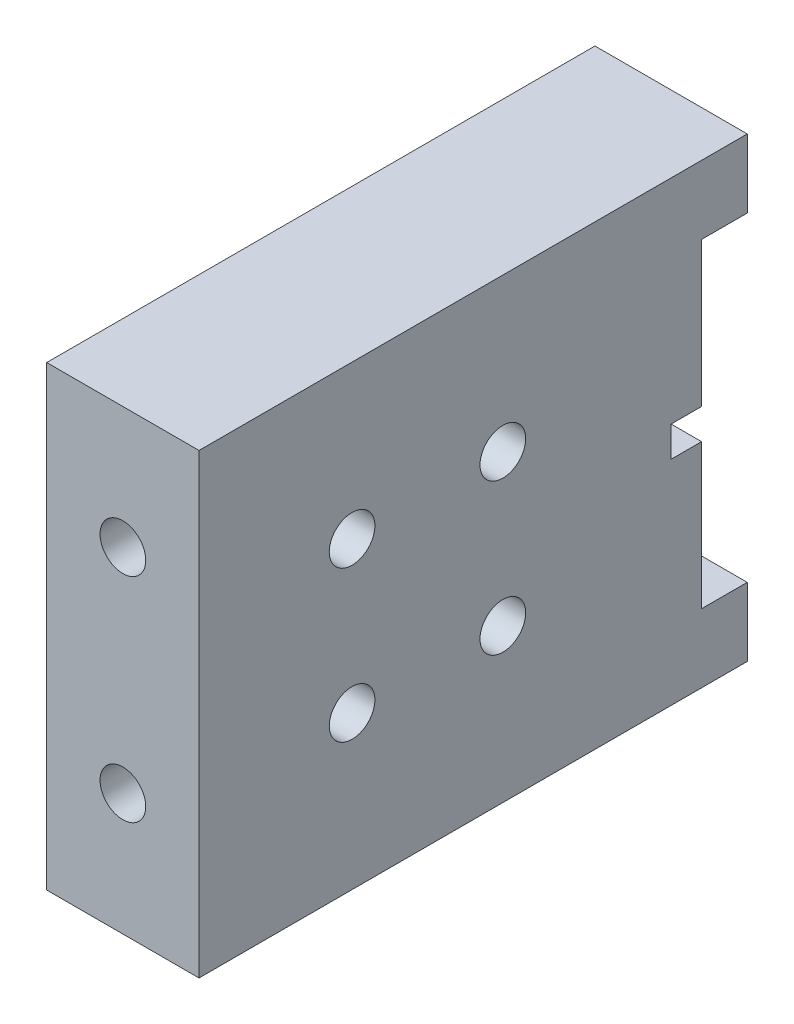
ISO-10303-21;
HEADER;
FILE_DESCRIPTION(('STEP AP214'),'2;1');
FILE_NAME('part.step','',(''),(''),'','','');
FILE_SCHEMA(('AUTOMOTIVE_DESIGN { 1 0 10303 214 1 1 1 1 }'));
ENDSEC;
DATA;
#1=APPLICATION_CONTEXT('core data for automotive mechanical design processes');
#2=APPLICATION_PROTOCOL_DEFINITION('international standard','automotive_design',2000,#1);
#3=PRODUCT_CONTEXT('',#1,'mechanical');
#4=PRODUCT('Part','Part','',(#3));
#5=PRODUCT_RELATED_PRODUCT_CATEGORY('part','',(#4));
#6=PRODUCT_DEFINITION_FORMATION('','',#4);
#7=PRODUCT_DEFINITION_CONTEXT('part definition',#1,'design');
#8=PRODUCT_DEFINITION('design','',#6,#7);
#9=PRODUCT_DEFINITION_SHAPE('','',#8);
#10=(LENGTH_UNIT() NAMED_UNIT(*) SI_UNIT(.MILLI.,.METRE.));
#11=(NAMED_UNIT(*) PLANE_ANGLE_UNIT() SI_UNIT($,.RADIAN.));
#12=(NAMED_UNIT(*) SI_UNIT($,.STERADIAN.) SOLID_ANGLE_UNIT());
#13=UNCERTAINTY_MEASURE_WITH_UNIT(LENGTH_MEASURE(1.E-05),#10,'distance_accuracy_value','');
#14=(GEOMETRIC_REPRESENTATION_CONTEXT(3) GLOBAL_UNCERTAINTY_ASSIGNED_CONTEXT((#13)) GLOBAL_UNIT_ASSIGNED_CONTEXT((#10,
#11,#12)) REPRESENTATION_CONTEXT('',''));
#15=CARTESIAN_POINT('',(0.,0.,0.));
#16=DIRECTION('',(0.,0.,1.));
#17=DIRECTION('',(1.,0.,0.));
#18=AXIS2_PLACEMENT_3D('',#15,#16,#17);
#19=CARTESIAN_POINT('',(10.,14.,-33.));
#20=DIRECTION('',(1.,0.,0.));
#21=DIRECTION('',(0.,0.,-1.));
#22=AXIS2_PLACEMENT_3D('',#19,#20,#21);
#23=PLANE('',#22);
#24=DIRECTION('',(0.,-1.,0.));
#25=VECTOR('',#24,1.);
#26=CARTESIAN_POINT('',(10.,4.5,-33.));
#27=LINE('',#26,#25);
#28=CARTESIAN_POINT('',(9.99999999999999,25.5,-33.));
#29=VERTEX_POINT('',#28);
#30=CARTESIAN_POINT('',(10.,16.,-33.));
#31=VERTEX_POINT('',#30);
#32=EDGE_CURVE('E131',#29,#31,#27,.T.);
#33=ORIENTED_EDGE('',*,*,#32,.F.);
#34=DIRECTION('',(0.,0.,-1.));
#35=VECTOR('',#34,1.);
#36=CARTESIAN_POINT('',(10.,25.5,-33.));
#37=LINE('',#36,#35);
#38=CARTESIAN_POINT('',(10.,25.5,-36.));
#39=VERTEX_POINT('',#38);
#40=EDGE_CURVE('E135',#29,#39,#37,.T.);
#41=ORIENTED_EDGE('',*,*,#40,.T.);
#42=DIRECTION('',(0.,-1.,0.));
#43=VECTOR('',#42,1.);
#44=CARTESIAN_POINT('',(10.,30.,-36.));
#45=LINE('',#44,#43);
#46=CARTESIAN_POINT('',(10.,30.,-36.));
#47=VERTEX_POINT('',#46);
#48=EDGE_CURVE('E217',#47,#39,#45,.T.);
#49=ORIENTED_EDGE('',*,*,#48,.F.);
#50=DIRECTION('',(0.,0.,-1.));
#51=VECTOR('',#50,1.);
#52=CARTESIAN_POINT('',(9.99999999999994,30.,0.));
#53=LINE('',#52,#51);
#54=CARTESIAN_POINT('',(10.,30.,0.));
#55=VERTEX_POINT('',#54);
#56=EDGE_CURVE('E249',#55,#47,#53,.T.);
#57=ORIENTED_EDGE('',*,*,#56,.F.);
#58=DIRECTION('',(0.,-1.,0.));
#59=VECTOR('',#58,1.);
#60=CARTESIAN_POINT('',(10.,30.,0.));
#61=LINE('',#60,#59);
#62=CARTESIAN_POINT('',(10.,0.,0.));
#63=VERTEX_POINT('',#62);
#64=EDGE_CURVE('E241',#55,#63,#61,.T.);
#65=ORIENTED_EDGE('',*,*,#64,.T.);
#66=DIRECTION('',(0.,0.,-1.));
#67=VECTOR('',#66,1.);
#68=CARTESIAN_POINT('',(9.99999999999994,0.,0.));
#69=LINE('',#68,#67);
#70=CARTESIAN_POINT('',(10.,0.,-36.));
#71=VERTEX_POINT('',#70);
#72=EDGE_CURVE('E234',#63,#71,#69,.T.);
#73=ORIENTED_EDGE('',*,*,#72,.T.);
#74=CARTESIAN_POINT('',(10.,4.5,-36.));
#75=VERTEX_POINT('',#74);
#76=EDGE_CURVE('E236',#75,#71,#45,.T.);
#77=ORIENTED_EDGE('',*,*,#76,.F.);
#78=DIRECTION('',(0.,0.,-1.));
#79=VECTOR('',#78,1.);
#80=CARTESIAN_POINT('',(10.,4.5,-33.));
#81=LINE('',#80,#79);
#82=CARTESIAN_POINT('',(10.,4.5,-33.));
#83=VERTEX_POINT('',#82);
#84=EDGE_CURVE('E159',#83,#75,#81,.T.);
#85=ORIENTED_EDGE('',*,*,#84,.F.);
#86=CARTESIAN_POINT('',(10.,14.,-33.));
#87=VERTEX_POINT('',#86);
#88=EDGE_CURVE('E142',#87,#83,#27,.T.);
#89=ORIENTED_EDGE('',*,*,#88,.F.);
#90=DIRECTION('',(0.,0.,1.));
#91=VECTOR('',#90,1.);
#92=CARTESIAN_POINT('',(10.,14.,0.));
#93=LINE('',#92,#91);
#94=CARTESIAN_POINT('',(10.,14.,-31.));
#95=VERTEX_POINT('',#94);
#96=EDGE_CURVE('E173',#87,#95,#93,.T.);
#97=ORIENTED_EDGE('',*,*,#96,.T.);
#98=DIRECTION('',(0.,-1.,0.));
#99=VECTOR('',#98,1.);
#100=CARTESIAN_POINT('',(10.,30.,-31.));
#101=LINE('',#100,#99);
#102=CARTESIAN_POINT('',(10.,16.,-31.));
#103=VERTEX_POINT('',#102);
#104=EDGE_CURVE('E171',#103,#95,#101,.T.);
#105=ORIENTED_EDGE('',*,*,#104,.F.);
#106=DIRECTION('',(0.,0.,-1.));
#107=VECTOR('',#106,1.);
#108=CARTESIAN_POINT('',(10.,16.,0.));
#109=LINE('',#108,#107);
#110=EDGE_CURVE('E138',#103,#31,#109,.T.);
#111=ORIENTED_EDGE('',*,*,#110,.T.);
#112=EDGE_LOOP('',(#33,#41,#49,#57,#65,#73,#77,#85,#89,#97,#105,#111));
#113=FACE_BOUND('',#112,.T.);
#114=CARTESIAN_POINT('',(10.,19.9497474683058,-10.0502525316942));
#115=DIRECTION('',(-1.,0.,0.));
#116=DIRECTION('',(0.,0.,1.));
#117=AXIS2_PLACEMENT_3D('',#114,#115,#116);
#118=CIRCLE('',#117,1.5);
#119=CARTESIAN_POINT('',(10.,19.9497474683058,-8.55025253169417));
#120=VERTEX_POINT('',#119);
#121=EDGE_CURVE('E220',#120,#120,#118,.T.);
#122=ORIENTED_EDGE('',*,*,#121,.T.);
#123=EDGE_LOOP('',(#122));
#124=FACE_BOUND('',#123,.T.);
#125=CARTESIAN_POINT('',(10.,10.0502525316942,-19.9497474683058));
#126=DIRECTION('',(-1.,0.,0.));
#127=DIRECTION('',(0.,0.,1.));
#128=AXIS2_PLACEMENT_3D('',#125,#126,#127);
#129=CIRCLE('',#128,1.5);
#130=CARTESIAN_POINT('',(10.,10.0502525316942,-18.4497474683058));
#131=VERTEX_POINT('',#130);
#132=EDGE_CURVE('E223',#131,#131,#129,.T.);
#133=ORIENTED_EDGE('',*,*,#132,.T.);
#134=EDGE_LOOP('',(#133));
#135=FACE_BOUND('',#134,.T.);
#136=CARTESIAN_POINT('',(10.,10.0502525316942,-10.0502525316942));
#137=DIRECTION('',(-1.,0.,0.));
#138=DIRECTION('',(0.,0.,1.));
#139=AXIS2_PLACEMENT_3D('',#136,#137,#138);
#140=CIRCLE('',#139,1.5);
#141=CARTESIAN_POINT('',(10.,10.0502525316942,-8.55025253169416));
#142=VERTEX_POINT('',#141);
#143=EDGE_CURVE('E227',#142,#142,#140,.T.);
#144=ORIENTED_EDGE('',*,*,#143,.T.);
#145=EDGE_LOOP('',(#144));
#146=FACE_BOUND('',#145,.T.);
#147=CARTESIAN_POINT('',(10.,19.9497474683058,-19.9497474683058));
#148=DIRECTION('',(-1.,0.,0.));
#149=DIRECTION('',(0.,0.,1.));
#150=AXIS2_PLACEMENT_3D('',#147,#148,#149);
#151=CIRCLE('',#150,1.5);
#152=CARTESIAN_POINT('',(10.,19.9497474683058,-18.4497474683058));
#153=VERTEX_POINT('',#152);
#154=EDGE_CURVE('E231',#153,#153,#151,.T.);
#155=ORIENTED_EDGE('',*,*,#154,.T.);
#156=EDGE_LOOP('',(#155));
#157=FACE_BOUND('',#156,.T.);
#158=ADVANCED_FACE('F37',(#113,#124,#135,#146,#157),#23,.T.);
#159=CARTESIAN_POINT('',(5.4,9.99999999999999,-29.));
#160=DIRECTION('',(0.,0.,-1.));
#161=DIRECTION('',(-1.,0.,0.));
#162=AXIS2_PLACEMENT_3D('',#159,#160,#161);
#163=PLANE('',#162);
#164=CARTESIAN_POINT('',(5.4,9.99999999999999,-29.));
#165=DIRECTION('',(0.,0.,-1.));
#166=DIRECTION('',(-1.,0.,0.));
#167=AXIS2_PLACEMENT_3D('',#164,#165,#166);
#168=CIRCLE('',#167,1.);
#169=CARTESIAN_POINT('',(4.4,9.99999999999999,-29.));
#170=VERTEX_POINT('',#169);
#171=EDGE_CURVE('E183',#170,#170,#168,.T.);
#172=ORIENTED_EDGE('',*,*,#171,.T.);
#173=EDGE_LOOP('',(#172));
#174=FACE_BOUND('',#173,.T.);
#175=ADVANCED_FACE('F317',(#174),#163,.T.);
#176=CARTESIAN_POINT('',(5.,22.,-4.));
#177=DIRECTION('',(0.,0.,1.));
#178=DIRECTION('',(1.,0.,0.));
#179=AXIS2_PLACEMENT_3D('',#176,#177,#178);
#180=PLANE('',#179);
#181=CARTESIAN_POINT('',(5.,22.,-4.));
#182=DIRECTION('',(0.,0.,1.));
#183=DIRECTION('',(1.,0.,0.));
#184=AXIS2_PLACEMENT_3D('',#181,#182,#183);
#185=CIRCLE('',#184,1.5);
#186=CARTESIAN_POINT('',(6.5,22.,-4.));
#187=VERTEX_POINT('',#186);
#188=EDGE_CURVE('E193',#187,#187,#185,.T.);
#189=ORIENTED_EDGE('',*,*,#188,.T.);
#190=EDGE_LOOP('',(#189));
#191=FACE_BOUND('',#190,.T.);
#192=ADVANCED_FACE('F319',(#191),#180,.T.);
#193=CARTESIAN_POINT('',(5.,8.,-4.));
#194=DIRECTION('',(0.,0.,1.));
#195=DIRECTION('',(1.,0.,0.));
#196=AXIS2_PLACEMENT_3D('',#193,#194,#195);
#197=PLANE('',#196);
#198=CARTESIAN_POINT('',(5.,8.,-4.));
#199=DIRECTION('',(0.,0.,1.));
#200=DIRECTION('',(1.,0.,0.));
#201=AXIS2_PLACEMENT_3D('',#198,#199,#200);
#202=CIRCLE('',#201,1.5);
#203=CARTESIAN_POINT('',(6.5,8.,-4.));
#204=VERTEX_POINT('',#203);
#205=EDGE_CURVE('E46',#204,#204,#202,.T.);
#206=ORIENTED_EDGE('',*,*,#205,.T.);
#207=EDGE_LOOP('',(#206));
#208=FACE_BOUND('',#207,.T.);
#209=ADVANCED_FACE('F326',(#208),#197,.T.);
#210=CARTESIAN_POINT('',(5.4,20.,-29.));
#211=DIRECTION('',(0.,0.,-1.));
#212=DIRECTION('',(-1.,0.,0.));
#213=AXIS2_PLACEMENT_3D('',#210,#211,#212);
#214=PLANE('',#213);
#215=CARTESIAN_POINT('',(5.4,20.,-29.));
#216=DIRECTION('',(0.,0.,-1.));
#217=DIRECTION('',(-1.,0.,0.));
#218=AXIS2_PLACEMENT_3D('',#215,#216,#217);
#219=CIRCLE('',#218,1.);
#220=CARTESIAN_POINT('',(4.4,20.,-29.));
#221=VERTEX_POINT('',#220);
#222=EDGE_CURVE('E187',#221,#221,#219,.T.);
#223=ORIENTED_EDGE('',*,*,#222,.T.);
#224=EDGE_LOOP('',(#223));
#225=FACE_BOUND('',#224,.T.);
#226=ADVANCED_FACE('F338',(#225),#214,.T.);
#227=CARTESIAN_POINT('',(5.4,9.99999999999999,-29.));
#228=DIRECTION('',(0.,0.,-1.));
#229=DIRECTION('',(-1.,0.,0.));
#230=AXIS2_PLACEMENT_3D('',#227,#228,#229);
#231=CYLINDRICAL_SURFACE('',#230,1.);
#232=ORIENTED_EDGE('',*,*,#171,.F.);
#233=EDGE_LOOP('',(#232));
#234=FACE_BOUND('',#233,.T.);
#235=CARTESIAN_POINT('',(5.4,9.99999999999999,-33.));
#236=DIRECTION('',(0.,0.,-1.));
#237=DIRECTION('',(-1.,0.,0.));
#238=AXIS2_PLACEMENT_3D('',#235,#236,#237);
#239=CIRCLE('',#238,1.);
#240=CARTESIAN_POINT('',(4.4,9.99999999999999,-33.));
#241=VERTEX_POINT('',#240);
#242=EDGE_CURVE('E184',#241,#241,#239,.T.);
#243=ORIENTED_EDGE('',*,*,#242,.T.);
#244=EDGE_LOOP('',(#243));
#245=FACE_BOUND('',#244,.T.);
#246=ADVANCED_FACE('F332',(#234,#245),#231,.F.);
#247=CARTESIAN_POINT('',(5.,22.,-4.));
#248=DIRECTION('',(0.,0.,1.));
#249=DIRECTION('',(1.,0.,0.));
#250=AXIS2_PLACEMENT_3D('',#247,#248,#249);
#251=CYLINDRICAL_SURFACE('',#250,1.5);
#252=ORIENTED_EDGE('',*,*,#188,.F.);
#253=EDGE_LOOP('',(#252));
#254=FACE_BOUND('',#253,.T.);
#255=CARTESIAN_POINT('',(5.,22.,0.));
#256=DIRECTION('',(0.,0.,1.));
#257=DIRECTION('',(1.,0.,0.));
#258=AXIS2_PLACEMENT_3D('',#255,#256,#257);
#259=CIRCLE('',#258,1.5);
#260=CARTESIAN_POINT('',(6.5,22.,0.));
#261=VERTEX_POINT('',#260);
#262=EDGE_CURVE('E196',#261,#261,#259,.T.);
#263=ORIENTED_EDGE('',*,*,#262,.T.);
#264=EDGE_LOOP('',(#263));
#265=FACE_BOUND('',#264,.T.);
#266=ADVANCED_FACE('F342',(#254,#265),#251,.F.);
#267=CARTESIAN_POINT('',(5.,8.,-4.));
#268=DIRECTION('',(0.,0.,1.));
#269=DIRECTION('',(1.,0.,0.));
#270=AXIS2_PLACEMENT_3D('',#267,#268,#269);
#271=CYLINDRICAL_SURFACE('',#270,1.5);
#272=ORIENTED_EDGE('',*,*,#205,.F.);
#273=EDGE_LOOP('',(#272));
#274=FACE_BOUND('',#273,.T.);
#275=CARTESIAN_POINT('',(5.,8.,0.));
#276=DIRECTION('',(0.,0.,1.));
#277=DIRECTION('',(1.,0.,0.));
#278=AXIS2_PLACEMENT_3D('',#275,#276,#277);
#279=CIRCLE('',#278,1.5);
#280=CARTESIAN_POINT('',(6.5,8.,0.));
#281=VERTEX_POINT('',#280);
#282=EDGE_CURVE('E11',#281,#281,#279,.T.);
#283=ORIENTED_EDGE('',*,*,#282,.T.);
#284=EDGE_LOOP('',(#283));
#285=FACE_BOUND('',#284,.T.);
#286=ADVANCED_FACE('F344',(#274,#285),#271,.F.);
#287=CARTESIAN_POINT('',(10.,25.5,-33.));
#288=DIRECTION('',(0.,1.,0.));
#289=DIRECTION('',(0.,0.,1.));
#290=AXIS2_PLACEMENT_3D('',#287,#288,#289);
#291=PLANE('',#290);
#292=DIRECTION('',(1.,0.,0.));
#293=VECTOR('',#292,1.);
#294=CARTESIAN_POINT('',(10.,25.5,-36.));
#295=LINE('',#294,#293);
#296=CARTESIAN_POINT('',(2.,25.5,-36.));
#297=VERTEX_POINT('',#296);
#298=EDGE_CURVE('E151',#297,#39,#295,.T.);
#299=ORIENTED_EDGE('',*,*,#298,.T.);
#300=ORIENTED_EDGE('',*,*,#40,.F.);
#301=DIRECTION('',(1.,0.,0.));
#302=VECTOR('',#301,1.);
#303=CARTESIAN_POINT('',(10.,25.5,-33.));
#304=LINE('',#303,#302);
#305=CARTESIAN_POINT('',(2.,25.5,-33.));
#306=VERTEX_POINT('',#305);
#307=EDGE_CURVE('E149',#306,#29,#304,.T.);
#308=ORIENTED_EDGE('',*,*,#307,.F.);
#309=DIRECTION('',(0.,0.,-1.));
#310=VECTOR('',#309,1.);
#311=CARTESIAN_POINT('',(2.,25.5,-33.));
#312=LINE('',#311,#310);
#313=EDGE_CURVE('E152',#306,#297,#312,.T.);
#314=ORIENTED_EDGE('',*,*,#313,.T.);
#315=EDGE_LOOP('',(#299,#300,#308,#314));
#316=FACE_BOUND('',#315,.T.);
#317=ADVANCED_FACE('F147',(#316),#291,.F.);
#318=CARTESIAN_POINT('',(5.4,20.,-29.));
#319=DIRECTION('',(0.,0.,-1.));
#320=DIRECTION('',(-1.,0.,0.));
#321=AXIS2_PLACEMENT_3D('',#318,#319,#320);
#322=CYLINDRICAL_SURFACE('',#321,1.);
#323=ORIENTED_EDGE('',*,*,#222,.F.);
#324=EDGE_LOOP('',(#323));
#325=FACE_BOUND('',#324,.T.);
#326=CARTESIAN_POINT('',(5.4,20.,-33.));
#327=DIRECTION('',(0.,0.,-1.));
#328=DIRECTION('',(-1.,0.,0.));
#329=AXIS2_PLACEMENT_3D('',#326,#327,#328);
#330=CIRCLE('',#329,1.);
#331=CARTESIAN_POINT('',(4.4,20.,-33.));
#332=VERTEX_POINT('',#331);
#333=EDGE_CURVE('E190',#332,#332,#330,.T.);
#334=ORIENTED_EDGE('',*,*,#333,.T.);
#335=EDGE_LOOP('',(#334));
#336=FACE_BOUND('',#335,.T.);
#337=ADVANCED_FACE('F334',(#325,#336),#322,.F.);
#338=CARTESIAN_POINT('',(0.,0.,-33.));
#339=DIRECTION('',(0.,0.,1.));
#340=DIRECTION('',(1.,0.,0.));
#341=AXIS2_PLACEMENT_3D('',#338,#339,#340);
#342=PLANE('',#341);
#343=ORIENTED_EDGE('',*,*,#242,.F.);
#344=EDGE_LOOP('',(#343));
#345=FACE_BOUND('',#344,.T.);
#346=DIRECTION('',(0.,1.,0.));
#347=VECTOR('',#346,1.);
#348=CARTESIAN_POINT('',(2.,4.5,-33.));
#349=LINE('',#348,#347);
#350=CARTESIAN_POINT('',(2.,4.5,-33.));
#351=VERTEX_POINT('',#350);
#352=CARTESIAN_POINT('',(2.,14.,-33.));
#353=VERTEX_POINT('',#352);
#354=EDGE_CURVE('E158',#351,#353,#349,.T.);
#355=ORIENTED_EDGE('',*,*,#354,.T.);
#356=DIRECTION('',(1.,0.,0.));
#357=VECTOR('',#356,1.);
#358=CARTESIAN_POINT('',(0.,14.,-33.));
#359=LINE('',#358,#357);
#360=EDGE_CURVE('E210',#353,#87,#359,.T.);
#361=ORIENTED_EDGE('',*,*,#360,.T.);
#362=ORIENTED_EDGE('',*,*,#88,.T.);
#363=DIRECTION('',(-1.,0.,0.));
#364=VECTOR('',#363,1.);
#365=CARTESIAN_POINT('',(10.,4.5,-33.));
#366=LINE('',#365,#364);
#367=EDGE_CURVE('E143',#83,#351,#366,.T.);
#368=ORIENTED_EDGE('',*,*,#367,.T.);
#369=EDGE_LOOP('',(#355,#361,#362,#368));
#370=FACE_BOUND('',#369,.T.);
#371=ADVANCED_FACE('F212',(#345,#370),#342,.F.);
#372=ORIENTED_EDGE('',*,*,#333,.F.);
#373=EDGE_LOOP('',(#372));
#374=FACE_BOUND('',#373,.T.);
#375=ORIENTED_EDGE('',*,*,#32,.T.);
#376=DIRECTION('',(-1.,0.,0.));
#377=VECTOR('',#376,1.);
#378=CARTESIAN_POINT('',(0.,16.,-33.));
#379=LINE('',#378,#377);
#380=CARTESIAN_POINT('',(2.,16.,-33.));
#381=VERTEX_POINT('',#380);
#382=EDGE_CURVE('E215',#31,#381,#379,.T.);
#383=ORIENTED_EDGE('',*,*,#382,.T.);
#384=EDGE_CURVE('E156',#381,#306,#349,.T.);
#385=ORIENTED_EDGE('',*,*,#384,.T.);
#386=ORIENTED_EDGE('',*,*,#307,.T.);
#387=EDGE_LOOP('',(#375,#383,#385,#386));
#388=FACE_BOUND('',#387,.T.);
#389=ADVANCED_FACE('F155',(#374,#388),#342,.F.);
#390=CARTESIAN_POINT('',(58.3,16.,-31.));
#391=DIRECTION('',(0.,1.,0.));
#392=DIRECTION('',(-1.,0.,0.));
#393=AXIS2_PLACEMENT_3D('',#390,#391,#392);
#394=PLANE('',#393);
#395=DIRECTION('',(1.,0.,0.));
#396=VECTOR('',#395,1.);
#397=CARTESIAN_POINT('',(58.3,16.,-31.));
#398=LINE('',#397,#396);
#399=CARTESIAN_POINT('',(2.,16.,-31.));
#400=VERTEX_POINT('',#399);
#401=EDGE_CURVE('E41',#400,#103,#398,.T.);
#402=ORIENTED_EDGE('',*,*,#401,.F.);
#403=DIRECTION('',(0.,0.,-1.));
#404=VECTOR('',#403,1.);
#405=CARTESIAN_POINT('',(2.,16.,-31.));
#406=LINE('',#405,#404);
#407=EDGE_CURVE('E54',#400,#381,#406,.T.);
#408=ORIENTED_EDGE('',*,*,#407,.T.);
#409=ORIENTED_EDGE('',*,*,#382,.F.);
#410=ORIENTED_EDGE('',*,*,#110,.F.);
#411=EDGE_LOOP('',(#402,#408,#409,#410));
#412=FACE_BOUND('',#411,.T.);
#413=ADVANCED_FACE('F39',(#412),#394,.F.);
#414=CARTESIAN_POINT('',(2.,4.5,-33.));
#415=DIRECTION('',(-1.,0.,0.));
#416=DIRECTION('',(0.,0.,1.));
#417=AXIS2_PLACEMENT_3D('',#414,#415,#416);
#418=PLANE('',#417);
#419=ORIENTED_EDGE('',*,*,#384,.F.);
#420=ORIENTED_EDGE('',*,*,#407,.F.);
#421=DIRECTION('',(0.,1.,0.));
#422=VECTOR('',#421,1.);
#423=CARTESIAN_POINT('',(2.,16.,-31.));
#424=LINE('',#423,#422);
#425=CARTESIAN_POINT('',(2.,14.,-31.));
#426=VERTEX_POINT('',#425);
#427=EDGE_CURVE('E181',#426,#400,#424,.T.);
#428=ORIENTED_EDGE('',*,*,#427,.F.);
#429=DIRECTION('',(0.,0.,-1.));
#430=VECTOR('',#429,1.);
#431=CARTESIAN_POINT('',(2.,14.,-31.));
#432=LINE('',#431,#430);
#433=EDGE_CURVE('E177',#426,#353,#432,.T.);
#434=ORIENTED_EDGE('',*,*,#433,.T.);
#435=ORIENTED_EDGE('',*,*,#354,.F.);
#436=DIRECTION('',(0.,0.,-1.));
#437=VECTOR('',#436,1.);
#438=CARTESIAN_POINT('',(2.,4.5,-33.));
#439=LINE('',#438,#437);
#440=CARTESIAN_POINT('',(2.,4.5,-36.));
#441=VERTEX_POINT('',#440);
#442=EDGE_CURVE('E163',#351,#441,#439,.T.);
#443=ORIENTED_EDGE('',*,*,#442,.T.);
#444=DIRECTION('',(0.,1.,0.));
#445=VECTOR('',#444,1.);
#446=CARTESIAN_POINT('',(2.,4.5,-36.));
#447=LINE('',#446,#445);
#448=EDGE_CURVE('E277',#441,#297,#447,.T.);
#449=ORIENTED_EDGE('',*,*,#448,.T.);
#450=ORIENTED_EDGE('',*,*,#313,.F.);
#451=EDGE_LOOP('',(#419,#420,#428,#434,#435,#443,#449,#450));
#452=FACE_BOUND('',#451,.T.);
#453=ADVANCED_FACE('F357',(#452),#418,.F.);
#454=CARTESIAN_POINT('',(58.3,14.,-31.));
#455=DIRECTION('',(0.,-1.,0.));
#456=DIRECTION('',(1.,0.,0.));
#457=AXIS2_PLACEMENT_3D('',#454,#455,#456);
#458=PLANE('',#457);
#459=ORIENTED_EDGE('',*,*,#360,.F.);
#460=ORIENTED_EDGE('',*,*,#433,.F.);
#461=DIRECTION('',(-1.,0.,0.));
#462=VECTOR('',#461,1.);
#463=CARTESIAN_POINT('',(58.3,14.,-31.));
#464=LINE('',#463,#462);
#465=EDGE_CURVE('E62',#95,#426,#464,.T.);
#466=ORIENTED_EDGE('',*,*,#465,.F.);
#467=ORIENTED_EDGE('',*,*,#96,.F.);
#468=EDGE_LOOP('',(#459,#460,#466,#467));
#469=FACE_BOUND('',#468,.T.);
#470=ADVANCED_FACE('F209',(#469),#458,.F.);
#471=CARTESIAN_POINT('',(0.,0.,-31.));
#472=DIRECTION('',(0.,0.,-1.));
#473=DIRECTION('',(-1.,0.,0.));
#474=AXIS2_PLACEMENT_3D('',#471,#472,#473);
#475=PLANE('',#474);
#476=ORIENTED_EDGE('',*,*,#104,.T.);
#477=ORIENTED_EDGE('',*,*,#465,.T.);
#478=ORIENTED_EDGE('',*,*,#427,.T.);
#479=ORIENTED_EDGE('',*,*,#401,.T.);
#480=EDGE_LOOP('',(#476,#477,#478,#479));
#481=FACE_BOUND('',#480,.T.);
#482=ADVANCED_FACE('F203',(#481),#475,.T.);
#483=CARTESIAN_POINT('',(0.,30.,-36.));
#484=DIRECTION('',(0.,0.,-1.));
#485=DIRECTION('',(-1.,0.,0.));
#486=AXIS2_PLACEMENT_3D('',#483,#484,#485);
#487=PLANE('',#486);
#488=ORIENTED_EDGE('',*,*,#298,.F.);
#489=ORIENTED_EDGE('',*,*,#448,.F.);
#490=DIRECTION('',(-1.,0.,0.));
#491=VECTOR('',#490,1.);
#492=CARTESIAN_POINT('',(10.,4.5,-36.));
#493=LINE('',#492,#491);
#494=EDGE_CURVE('E166',#75,#441,#493,.T.);
#495=ORIENTED_EDGE('',*,*,#494,.F.);
#496=ORIENTED_EDGE('',*,*,#76,.T.);
#497=DIRECTION('',(1.,0.,0.));
#498=VECTOR('',#497,1.);
#499=CARTESIAN_POINT('',(0.,0.,-36.));
#500=LINE('',#499,#498);
#501=CARTESIAN_POINT('',(0.,0.,-36.));
#502=VERTEX_POINT('',#501);
#503=EDGE_CURVE('E252',#502,#71,#500,.T.);
#504=ORIENTED_EDGE('',*,*,#503,.F.);
#505=DIRECTION('',(0.,-1.,0.));
#506=VECTOR('',#505,1.);
#507=CARTESIAN_POINT('',(0.,30.,-36.));
#508=LINE('',#507,#506);
#509=CARTESIAN_POINT('',(0.,30.,-36.));
#510=VERTEX_POINT('',#509);
#511=EDGE_CURVE('E237',#510,#502,#508,.T.);
#512=ORIENTED_EDGE('',*,*,#511,.F.);
#513=DIRECTION('',(1.,0.,0.));
#514=VECTOR('',#513,1.);
#515=CARTESIAN_POINT('',(0.,30.,-36.));
#516=LINE('',#515,#514);
#517=EDGE_CURVE('E262',#510,#47,#516,.T.);
#518=ORIENTED_EDGE('',*,*,#517,.T.);
#519=ORIENTED_EDGE('',*,*,#48,.T.);
#520=EDGE_LOOP('',(#488,#489,#495,#496,#504,#512,#518,#519));
#521=FACE_BOUND('',#520,.T.);
#522=ADVANCED_FACE('F285',(#521),#487,.T.);
#523=CARTESIAN_POINT('',(10.,4.5,-33.));
#524=DIRECTION('',(0.,-1.,0.));
#525=DIRECTION('',(0.,0.,-1.));
#526=AXIS2_PLACEMENT_3D('',#523,#524,#525);
#527=PLANE('',#526);
#528=ORIENTED_EDGE('',*,*,#494,.T.);
#529=ORIENTED_EDGE('',*,*,#442,.F.);
#530=ORIENTED_EDGE('',*,*,#367,.F.);
#531=ORIENTED_EDGE('',*,*,#84,.T.);
#532=EDGE_LOOP('',(#528,#529,#530,#531));
#533=FACE_BOUND('',#532,.T.);
#534=ADVANCED_FACE('F282',(#533),#527,.F.);
#535=CARTESIAN_POINT('',(0.,30.,0.));
#536=DIRECTION('',(-1.,0.,0.));
#537=DIRECTION('',(0.,0.,1.));
#538=AXIS2_PLACEMENT_3D('',#535,#536,#537);
#539=PLANE('',#538);
#540=CARTESIAN_POINT('',(0.,19.9497474683058,-10.0502525316942));
#541=DIRECTION('',(-1.,0.,0.));
#542=DIRECTION('',(0.,0.,1.));
#543=AXIS2_PLACEMENT_3D('',#540,#541,#542);
#544=CIRCLE('',#543,1.5);
#545=CARTESIAN_POINT('',(0.,19.9497474683058,-8.55025253169417));
#546=VERTEX_POINT('',#545);
#547=EDGE_CURVE('E230',#546,#546,#544,.T.);
#548=ORIENTED_EDGE('',*,*,#547,.F.);
#549=EDGE_LOOP('',(#548));
#550=FACE_BOUND('',#549,.T.);
#551=CARTESIAN_POINT('',(0.,10.0502525316942,-19.9497474683058));
#552=DIRECTION('',(-1.,0.,0.));
#553=DIRECTION('',(0.,0.,1.));
#554=AXIS2_PLACEMENT_3D('',#551,#552,#553);
#555=CIRCLE('',#554,1.5);
#556=CARTESIAN_POINT('',(0.,10.0502525316942,-18.4497474683058));
#557=VERTEX_POINT('',#556);
#558=EDGE_CURVE('E270',#557,#557,#555,.T.);
#559=ORIENTED_EDGE('',*,*,#558,.F.);
#560=EDGE_LOOP('',(#559));
#561=FACE_BOUND('',#560,.T.);
#562=CARTESIAN_POINT('',(0.,10.0502525316942,-10.0502525316942));
#563=DIRECTION('',(-1.,0.,0.));
#564=DIRECTION('',(0.,0.,1.));
#565=AXIS2_PLACEMENT_3D('',#562,#563,#564);
#566=CIRCLE('',#565,1.5);
#567=CARTESIAN_POINT('',(0.,10.0502525316942,-8.55025253169416));
#568=VERTEX_POINT('',#567);
#569=EDGE_CURVE('E153',#568,#568,#566,.T.);
#570=ORIENTED_EDGE('',*,*,#569,.F.);
#571=EDGE_LOOP('',(#570));
#572=FACE_BOUND('',#571,.T.);
#573=CARTESIAN_POINT('',(0.,19.9497474683058,-19.9497474683058));
#574=DIRECTION('',(-1.,0.,0.));
#575=DIRECTION('',(0.,0.,1.));
#576=AXIS2_PLACEMENT_3D('',#573,#574,#575);
#577=CIRCLE('',#576,1.5);
#578=CARTESIAN_POINT('',(0.,19.9497474683058,-18.4497474683058));
#579=VERTEX_POINT('',#578);
#580=EDGE_CURVE('E224',#579,#579,#577,.T.);
#581=ORIENTED_EDGE('',*,*,#580,.F.);
#582=EDGE_LOOP('',(#581));
#583=FACE_BOUND('',#582,.T.);
#584=DIRECTION('',(0.,0.,-1.));
#585=VECTOR('',#584,1.);
#586=CARTESIAN_POINT('',(0.,0.,0.));
#587=LINE('',#586,#585);
#588=CARTESIAN_POINT('',(0.,0.,0.));
#589=VERTEX_POINT('',#588);
#590=EDGE_CURVE('E248',#589,#502,#587,.T.);
#591=ORIENTED_EDGE('',*,*,#590,.F.);
#592=DIRECTION('',(0.,-1.,0.));
#593=VECTOR('',#592,1.);
#594=CARTESIAN_POINT('',(0.,30.,0.));
#595=LINE('',#594,#593);
#596=CARTESIAN_POINT('',(0.,30.,0.));
#597=VERTEX_POINT('',#596);
#598=EDGE_CURVE('E239',#597,#589,#595,.T.);
#599=ORIENTED_EDGE('',*,*,#598,.F.);
#600=DIRECTION('',(0.,0.,-1.));
#601=VECTOR('',#600,1.);
#602=CARTESIAN_POINT('',(0.,30.,0.));
#603=LINE('',#602,#601);
#604=EDGE_CURVE('E259',#597,#510,#603,.T.);
#605=ORIENTED_EDGE('',*,*,#604,.T.);
#606=ORIENTED_EDGE('',*,*,#511,.T.);
#607=EDGE_LOOP('',(#591,#599,#605,#606));
#608=FACE_BOUND('',#607,.T.);
#609=ADVANCED_FACE('F299',(#550,#561,#572,#583,#608),#539,.T.);
#610=CARTESIAN_POINT('',(95.,19.9497474683058,-10.0502525316942));
#611=DIRECTION('',(-1.,0.,0.));
#612=DIRECTION('',(0.,0.,1.));
#613=AXIS2_PLACEMENT_3D('',#610,#611,#612);
#614=CYLINDRICAL_SURFACE('',#613,1.5);
#615=ORIENTED_EDGE('',*,*,#547,.T.);
#616=EDGE_LOOP('',(#615));
#617=FACE_BOUND('',#616,.T.);
#618=ORIENTED_EDGE('',*,*,#121,.F.);
#619=EDGE_LOOP('',(#618));
#620=FACE_BOUND('',#619,.T.);
#621=ADVANCED_FACE('F302',(#617,#620),#614,.F.);
#622=CARTESIAN_POINT('',(95.,10.0502525316942,-19.9497474683058));
#623=DIRECTION('',(-1.,0.,0.));
#624=DIRECTION('',(0.,0.,1.));
#625=AXIS2_PLACEMENT_3D('',#622,#623,#624);
#626=CYLINDRICAL_SURFACE('',#625,1.5);
#627=ORIENTED_EDGE('',*,*,#558,.T.);
#628=EDGE_LOOP('',(#627));
#629=FACE_BOUND('',#628,.T.);
#630=ORIENTED_EDGE('',*,*,#132,.F.);
#631=EDGE_LOOP('',(#630));
#632=FACE_BOUND('',#631,.T.);
#633=ADVANCED_FACE('F309',(#629,#632),#626,.F.);
#634=CARTESIAN_POINT('',(95.,10.0502525316942,-10.0502525316942));
#635=DIRECTION('',(-1.,0.,0.));
#636=DIRECTION('',(0.,0.,1.));
#637=AXIS2_PLACEMENT_3D('',#634,#635,#636);
#638=CYLINDRICAL_SURFACE('',#637,1.5);
#639=ORIENTED_EDGE('',*,*,#569,.T.);
#640=EDGE_LOOP('',(#639));
#641=FACE_BOUND('',#640,.T.);
#642=ORIENTED_EDGE('',*,*,#143,.F.);
#643=EDGE_LOOP('',(#642));
#644=FACE_BOUND('',#643,.T.);
#645=ADVANCED_FACE('F465',(#641,#644),#638,.F.);
#646=CARTESIAN_POINT('',(95.,19.9497474683058,-19.9497474683058));
#647=DIRECTION('',(-1.,0.,0.));
#648=DIRECTION('',(0.,0.,1.));
#649=AXIS2_PLACEMENT_3D('',#646,#647,#648);
#650=CYLINDRICAL_SURFACE('',#649,1.5);
#651=ORIENTED_EDGE('',*,*,#580,.T.);
#652=EDGE_LOOP('',(#651));
#653=FACE_BOUND('',#652,.T.);
#654=ORIENTED_EDGE('',*,*,#154,.F.);
#655=EDGE_LOOP('',(#654));
#656=FACE_BOUND('',#655,.T.);
#657=ADVANCED_FACE('F475',(#653,#656),#650,.F.);
#658=CARTESIAN_POINT('',(0.,30.,0.));
#659=DIRECTION('',(0.,0.,-1.));
#660=DIRECTION('',(-1.,0.,0.));
#661=AXIS2_PLACEMENT_3D('',#658,#659,#660);
#662=PLANE('',#661);
#663=ORIENTED_EDGE('',*,*,#282,.F.);
#664=EDGE_LOOP('',(#663));
#665=FACE_BOUND('',#664,.T.);
#666=ORIENTED_EDGE('',*,*,#262,.F.);
#667=EDGE_LOOP('',(#666));
#668=FACE_BOUND('',#667,.T.);
#669=DIRECTION('',(1.,0.,0.));
#670=VECTOR('',#669,1.);
#671=CARTESIAN_POINT('',(0.,0.,0.));
#672=LINE('',#671,#670);
#673=EDGE_CURVE('E245',#589,#63,#672,.T.);
#674=ORIENTED_EDGE('',*,*,#673,.T.);
#675=ORIENTED_EDGE('',*,*,#64,.F.);
#676=DIRECTION('',(1.,0.,0.));
#677=VECTOR('',#676,1.);
#678=CARTESIAN_POINT('',(0.,30.,0.));
#679=LINE('',#678,#677);
#680=EDGE_CURVE('E244',#597,#55,#679,.T.);
#681=ORIENTED_EDGE('',*,*,#680,.F.);
#682=ORIENTED_EDGE('',*,*,#598,.T.);
#683=EDGE_LOOP('',(#674,#675,#681,#682));
#684=FACE_BOUND('',#683,.T.);
#685=ADVANCED_FACE('F293',(#665,#668,#684),#662,.F.);
#686=CARTESIAN_POINT('',(0.,0.,0.));
#687=DIRECTION('',(0.,1.,0.));
#688=DIRECTION('',(0.,0.,1.));
#689=AXIS2_PLACEMENT_3D('',#686,#687,#688);
#690=PLANE('',#689);
#691=ORIENTED_EDGE('',*,*,#72,.F.);
#692=ORIENTED_EDGE('',*,*,#673,.F.);
#693=ORIENTED_EDGE('',*,*,#590,.T.);
#694=ORIENTED_EDGE('',*,*,#503,.T.);
#695=EDGE_LOOP('',(#691,#692,#693,#694));
#696=FACE_BOUND('',#695,.T.);
#697=ADVANCED_FACE('F297',(#696),#690,.F.);
#698=CARTESIAN_POINT('',(0.,30.,0.));
#699=DIRECTION('',(0.,1.,0.));
#700=DIRECTION('',(0.,0.,1.));
#701=AXIS2_PLACEMENT_3D('',#698,#699,#700);
#702=PLANE('',#701);
#703=ORIENTED_EDGE('',*,*,#680,.T.);
#704=ORIENTED_EDGE('',*,*,#56,.T.);
#705=ORIENTED_EDGE('',*,*,#517,.F.);
#706=ORIENTED_EDGE('',*,*,#604,.F.);
#707=EDGE_LOOP('',(#703,#704,#705,#706));
#708=FACE_BOUND('',#707,.T.);
#709=ADVANCED_FACE('F291',(#708),#702,.T.);
#710=CLOSED_SHELL('',(#158,#175,#192,#209,#226,#246,#266,#286,#317,#337,#371,#389,#413,#453,
#470,#482,#522,#534,#609,#621,#633,#645,#657,#685,#697,#709));
#711=MANIFOLD_SOLID_BREP('B2',#710);
#712=ADVANCED_BREP_SHAPE_REPRESENTATION('',(#18,#711),#14);
#713=SHAPE_DEFINITION_REPRESENTATION(#9,#712);
ENDSEC;
END-ISO-10303-21;
